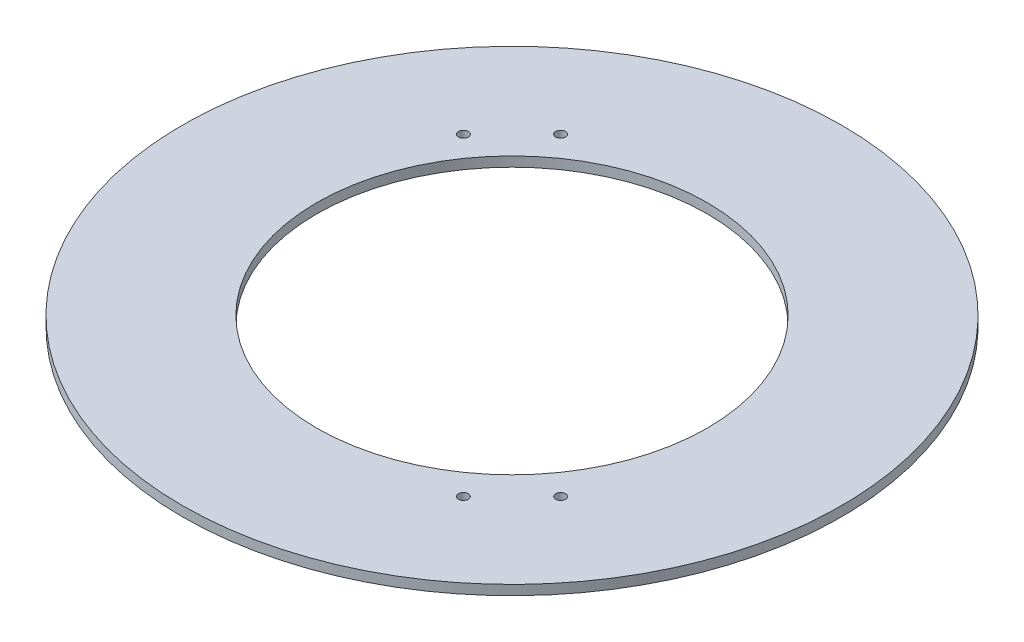
ISO-10303-21;
HEADER;
FILE_DESCRIPTION(('STEP AP214'),'2;1');
FILE_NAME('part.step','',(''),(''),'','','');
FILE_SCHEMA(('AUTOMOTIVE_DESIGN { 1 0 10303 214 1 1 1 1 }'));
ENDSEC;
DATA;
#1=APPLICATION_CONTEXT('core data for automotive mechanical design processes');
#2=APPLICATION_PROTOCOL_DEFINITION('international standard','automotive_design',2000,#1);
#3=PRODUCT_CONTEXT('',#1,'mechanical');
#4=PRODUCT('Part','Part','',(#3));
#5=PRODUCT_RELATED_PRODUCT_CATEGORY('part','',(#4));
#6=PRODUCT_DEFINITION_FORMATION('','',#4);
#7=PRODUCT_DEFINITION_CONTEXT('part definition',#1,'design');
#8=PRODUCT_DEFINITION('design','',#6,#7);
#9=PRODUCT_DEFINITION_SHAPE('','',#8);
#10=(LENGTH_UNIT() NAMED_UNIT(*) SI_UNIT(.MILLI.,.METRE.));
#11=(NAMED_UNIT(*) PLANE_ANGLE_UNIT() SI_UNIT($,.RADIAN.));
#12=(NAMED_UNIT(*) SI_UNIT($,.STERADIAN.) SOLID_ANGLE_UNIT());
#13=UNCERTAINTY_MEASURE_WITH_UNIT(LENGTH_MEASURE(1.E-05),#10,'distance_accuracy_value','');
#14=(GEOMETRIC_REPRESENTATION_CONTEXT(3) GLOBAL_UNCERTAINTY_ASSIGNED_CONTEXT((#13)) GLOBAL_UNIT_ASSIGNED_CONTEXT((#10,
#11,#12)) REPRESENTATION_CONTEXT('',''));
#15=CARTESIAN_POINT('',(0.,0.,0.));
#16=DIRECTION('',(0.,0.,1.));
#17=DIRECTION('',(1.,0.,0.));
#18=AXIS2_PLACEMENT_3D('',#15,#16,#17);
#19=CARTESIAN_POINT('',(0.,4.,0.));
#20=DIRECTION('',(0.,1.,0.));
#21=DIRECTION('',(0.,0.,1.));
#22=AXIS2_PLACEMENT_3D('',#19,#20,#21);
#23=PLANE('',#22);
#24=CARTESIAN_POINT('',(54.3022652612205,4.,74.2073211516225));
#25=DIRECTION('',(0.,1.,0.));
#26=DIRECTION('',(0.,0.,-1.));
#27=AXIS2_PLACEMENT_3D('',#24,#25,#26);
#28=CIRCLE('',#27,2.);
#29=CARTESIAN_POINT('',(54.3022652612205,4.,72.2073211516225));
#30=VERTEX_POINT('',#29);
#31=EDGE_CURVE('E62',#30,#30,#28,.T.);
#32=ORIENTED_EDGE('',*,*,#31,.F.);
#33=EDGE_LOOP('',(#32));
#34=FACE_BOUND('',#33,.T.);
#35=CARTESIAN_POINT('',(-74.2073211516223,4.,-54.3022652612207));
#36=DIRECTION('',(0.,1.,0.));
#37=DIRECTION('',(0.,0.,1.));
#38=AXIS2_PLACEMENT_3D('',#35,#36,#37);
#39=CIRCLE('',#38,2.);
#40=CARTESIAN_POINT('',(-74.2073211516223,4.,-52.3022652612207));
#41=VERTEX_POINT('',#40);
#42=EDGE_CURVE('E50',#41,#41,#39,.T.);
#43=ORIENTED_EDGE('',*,*,#42,.F.);
#44=EDGE_LOOP('',(#43));
#45=FACE_BOUND('',#44,.T.);
#46=CARTESIAN_POINT('',(0.,4.,0.));
#47=DIRECTION('',(0.,1.,0.));
#48=DIRECTION('',(0.,0.,1.));
#49=AXIS2_PLACEMENT_3D('',#46,#47,#48);
#50=CIRCLE('',#49,135.);
#51=CARTESIAN_POINT('',(0.,4.,135.));
#52=VERTEX_POINT('',#51);
#53=EDGE_CURVE('E10',#52,#52,#50,.T.);
#54=ORIENTED_EDGE('',*,*,#53,.T.);
#55=EDGE_LOOP('',(#54));
#56=FACE_BOUND('',#55,.T.);
#57=CARTESIAN_POINT('',(0.,4.,0.));
#58=DIRECTION('',(0.,1.,0.));
#59=DIRECTION('',(0.,0.,1.));
#60=AXIS2_PLACEMENT_3D('',#57,#58,#59);
#61=CIRCLE('',#60,80.);
#62=CARTESIAN_POINT('',(0.,4.,80.));
#63=VERTEX_POINT('',#62);
#64=EDGE_CURVE('E45',#63,#63,#61,.T.);
#65=ORIENTED_EDGE('',*,*,#64,.F.);
#66=EDGE_LOOP('',(#65));
#67=FACE_BOUND('',#66,.T.);
#68=CARTESIAN_POINT('',(-54.3022652612211,4.,-74.2073211516221));
#69=DIRECTION('',(0.,1.,0.));
#70=DIRECTION('',(0.,0.,-1.));
#71=AXIS2_PLACEMENT_3D('',#68,#69,#70);
#72=CIRCLE('',#71,2.);
#73=CARTESIAN_POINT('',(-54.3022652612211,4.,-76.2073211516221));
#74=VERTEX_POINT('',#73);
#75=EDGE_CURVE('E56',#74,#74,#72,.T.);
#76=ORIENTED_EDGE('',*,*,#75,.F.);
#77=EDGE_LOOP('',(#76));
#78=FACE_BOUND('',#77,.T.);
#79=CARTESIAN_POINT('',(74.2073211516219,4.,54.3022652612213));
#80=DIRECTION('',(0.,1.,0.));
#81=DIRECTION('',(0.,0.,1.));
#82=AXIS2_PLACEMENT_3D('',#79,#80,#81);
#83=CIRCLE('',#82,2.00000000000004);
#84=CARTESIAN_POINT('',(74.2073211516219,4.,56.3022652612213));
#85=VERTEX_POINT('',#84);
#86=EDGE_CURVE('E68',#85,#85,#83,.T.);
#87=ORIENTED_EDGE('',*,*,#86,.F.);
#88=EDGE_LOOP('',(#87));
#89=FACE_BOUND('',#88,.T.);
#90=ADVANCED_FACE('F34',(#34,#45,#56,#67,#78,#89),#23,.T.);
#91=CARTESIAN_POINT('',(0.,0.,0.));
#92=DIRECTION('',(0.,1.,0.));
#93=DIRECTION('',(0.,0.,1.));
#94=AXIS2_PLACEMENT_3D('',#91,#92,#93);
#95=PLANE('',#94);
#96=CARTESIAN_POINT('',(0.,0.,0.));
#97=DIRECTION('',(0.,1.,0.));
#98=DIRECTION('',(0.,0.,1.));
#99=AXIS2_PLACEMENT_3D('',#96,#97,#98);
#100=CIRCLE('',#99,135.);
#101=CARTESIAN_POINT('',(0.,0.,135.));
#102=VERTEX_POINT('',#101);
#103=EDGE_CURVE('E38',#102,#102,#100,.T.);
#104=ORIENTED_EDGE('',*,*,#103,.F.);
#105=EDGE_LOOP('',(#104));
#106=FACE_BOUND('',#105,.T.);
#107=CARTESIAN_POINT('',(0.,0.,0.));
#108=DIRECTION('',(0.,1.,0.));
#109=DIRECTION('',(0.,0.,1.));
#110=AXIS2_PLACEMENT_3D('',#107,#108,#109);
#111=CIRCLE('',#110,80.);
#112=CARTESIAN_POINT('',(0.,0.,80.));
#113=VERTEX_POINT('',#112);
#114=EDGE_CURVE('E47',#113,#113,#111,.T.);
#115=ORIENTED_EDGE('',*,*,#114,.T.);
#116=EDGE_LOOP('',(#115));
#117=FACE_BOUND('',#116,.T.);
#118=CARTESIAN_POINT('',(-74.2073211516223,0.,-54.3022652612207));
#119=DIRECTION('',(0.,1.,0.));
#120=DIRECTION('',(0.,0.,1.));
#121=AXIS2_PLACEMENT_3D('',#118,#119,#120);
#122=CIRCLE('',#121,2.);
#123=CARTESIAN_POINT('',(-74.2073211516223,0.,-52.3022652612207));
#124=VERTEX_POINT('',#123);
#125=EDGE_CURVE('E53',#124,#124,#122,.T.);
#126=ORIENTED_EDGE('',*,*,#125,.T.);
#127=EDGE_LOOP('',(#126));
#128=FACE_BOUND('',#127,.T.);
#129=CARTESIAN_POINT('',(-54.3022652612211,0.,-74.2073211516221));
#130=DIRECTION('',(0.,1.,0.));
#131=DIRECTION('',(0.,0.,-1.));
#132=AXIS2_PLACEMENT_3D('',#129,#130,#131);
#133=CIRCLE('',#132,2.);
#134=CARTESIAN_POINT('',(-54.3022652612211,0.,-76.2073211516221));
#135=VERTEX_POINT('',#134);
#136=EDGE_CURVE('E59',#135,#135,#133,.T.);
#137=ORIENTED_EDGE('',*,*,#136,.T.);
#138=EDGE_LOOP('',(#137));
#139=FACE_BOUND('',#138,.T.);
#140=CARTESIAN_POINT('',(54.3022652612205,0.,74.2073211516225));
#141=DIRECTION('',(0.,1.,0.));
#142=DIRECTION('',(0.,0.,-1.));
#143=AXIS2_PLACEMENT_3D('',#140,#141,#142);
#144=CIRCLE('',#143,2.);
#145=CARTESIAN_POINT('',(54.3022652612205,0.,72.2073211516225));
#146=VERTEX_POINT('',#145);
#147=EDGE_CURVE('E65',#146,#146,#144,.T.);
#148=ORIENTED_EDGE('',*,*,#147,.T.);
#149=EDGE_LOOP('',(#148));
#150=FACE_BOUND('',#149,.T.);
#151=CARTESIAN_POINT('',(74.2073211516219,0.,54.3022652612213));
#152=DIRECTION('',(0.,1.,0.));
#153=DIRECTION('',(0.,0.,1.));
#154=AXIS2_PLACEMENT_3D('',#151,#152,#153);
#155=CIRCLE('',#154,2.00000000000004);
#156=CARTESIAN_POINT('',(74.2073211516219,0.,56.3022652612213));
#157=VERTEX_POINT('',#156);
#158=EDGE_CURVE('E71',#157,#157,#155,.T.);
#159=ORIENTED_EDGE('',*,*,#158,.T.);
#160=EDGE_LOOP('',(#159));
#161=FACE_BOUND('',#160,.T.);
#162=ADVANCED_FACE('F81',(#106,#117,#128,#139,#150,#161),#95,.F.);
#163=CARTESIAN_POINT('',(0.,4.,0.));
#164=DIRECTION('',(0.,-1.,0.));
#165=DIRECTION('',(0.,0.,-1.));
#166=AXIS2_PLACEMENT_3D('',#163,#164,#165);
#167=CYLINDRICAL_SURFACE('',#166,135.);
#168=ORIENTED_EDGE('',*,*,#53,.F.);
#169=EDGE_LOOP('',(#168));
#170=FACE_BOUND('',#169,.T.);
#171=ORIENTED_EDGE('',*,*,#103,.T.);
#172=EDGE_LOOP('',(#171));
#173=FACE_BOUND('',#172,.T.);
#174=ADVANCED_FACE('F36',(#170,#173),#167,.T.);
#175=CARTESIAN_POINT('',(0.,4.,0.));
#176=DIRECTION('',(0.,-1.,0.));
#177=DIRECTION('',(0.,0.,-1.));
#178=AXIS2_PLACEMENT_3D('',#175,#176,#177);
#179=CYLINDRICAL_SURFACE('',#178,80.);
#180=ORIENTED_EDGE('',*,*,#64,.T.);
#181=EDGE_LOOP('',(#180));
#182=FACE_BOUND('',#181,.T.);
#183=ORIENTED_EDGE('',*,*,#114,.F.);
#184=EDGE_LOOP('',(#183));
#185=FACE_BOUND('',#184,.T.);
#186=ADVANCED_FACE('F91',(#182,#185),#179,.F.);
#187=CARTESIAN_POINT('',(-74.2073211516223,4.,-54.3022652612207));
#188=DIRECTION('',(0.,-1.,0.));
#189=DIRECTION('',(0.,0.,-1.));
#190=AXIS2_PLACEMENT_3D('',#187,#188,#189);
#191=CYLINDRICAL_SURFACE('',#190,2.);
#192=ORIENTED_EDGE('',*,*,#42,.T.);
#193=EDGE_LOOP('',(#192));
#194=FACE_BOUND('',#193,.T.);
#195=ORIENTED_EDGE('',*,*,#125,.F.);
#196=EDGE_LOOP('',(#195));
#197=FACE_BOUND('',#196,.T.);
#198=ADVANCED_FACE('F94',(#194,#197),#191,.F.);
#199=CARTESIAN_POINT('',(-54.3022652612211,4.,-74.2073211516221));
#200=DIRECTION('',(0.,-1.,0.));
#201=DIRECTION('',(0.,0.,-1.));
#202=AXIS2_PLACEMENT_3D('',#199,#200,#201);
#203=CYLINDRICAL_SURFACE('',#202,2.);
#204=ORIENTED_EDGE('',*,*,#75,.T.);
#205=EDGE_LOOP('',(#204));
#206=FACE_BOUND('',#205,.T.);
#207=ORIENTED_EDGE('',*,*,#136,.F.);
#208=EDGE_LOOP('',(#207));
#209=FACE_BOUND('',#208,.T.);
#210=ADVANCED_FACE('F98',(#206,#209),#203,.F.);
#211=CARTESIAN_POINT('',(54.3022652612205,4.,74.2073211516225));
#212=DIRECTION('',(0.,-1.,0.));
#213=DIRECTION('',(0.,0.,-1.));
#214=AXIS2_PLACEMENT_3D('',#211,#212,#213);
#215=CYLINDRICAL_SURFACE('',#214,2.);
#216=ORIENTED_EDGE('',*,*,#31,.T.);
#217=EDGE_LOOP('',(#216));
#218=FACE_BOUND('',#217,.T.);
#219=ORIENTED_EDGE('',*,*,#147,.F.);
#220=EDGE_LOOP('',(#219));
#221=FACE_BOUND('',#220,.T.);
#222=ADVANCED_FACE('F102',(#218,#221),#215,.F.);
#223=CARTESIAN_POINT('',(74.2073211516219,4.,54.3022652612213));
#224=DIRECTION('',(0.,-1.,0.));
#225=DIRECTION('',(0.,0.,-1.));
#226=AXIS2_PLACEMENT_3D('',#223,#224,#225);
#227=CYLINDRICAL_SURFACE('',#226,2.00000000000004);
#228=ORIENTED_EDGE('',*,*,#86,.T.);
#229=EDGE_LOOP('',(#228));
#230=FACE_BOUND('',#229,.T.);
#231=ORIENTED_EDGE('',*,*,#158,.F.);
#232=EDGE_LOOP('',(#231));
#233=FACE_BOUND('',#232,.T.);
#234=ADVANCED_FACE('F77',(#230,#233),#227,.F.);
#235=CLOSED_SHELL('',(#90,#162,#174,#186,#198,#210,#222,#234));
#236=MANIFOLD_SOLID_BREP('B2',#235);
#237=ADVANCED_BREP_SHAPE_REPRESENTATION('',(#18,#236),#14);
#238=SHAPE_DEFINITION_REPRESENTATION(#9,#237);
ENDSEC;
END-ISO-10303-21;
